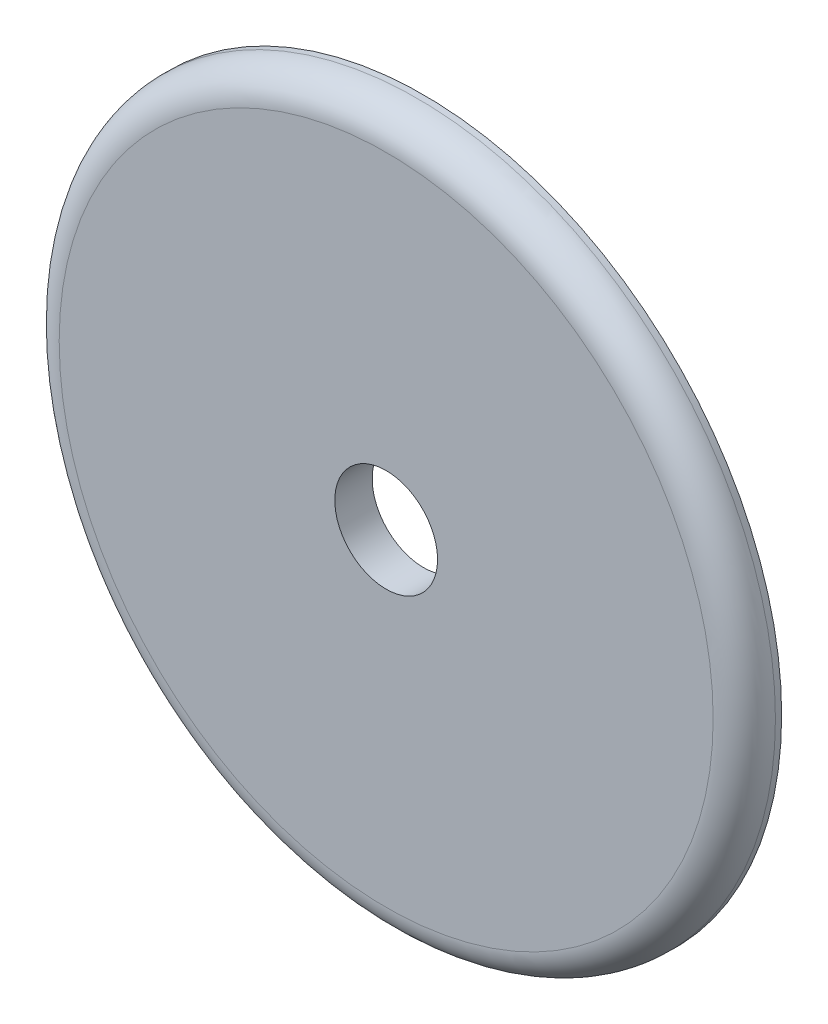
ISO-10303-21;
HEADER;
FILE_DESCRIPTION(('STEP AP214'),'2;1');
FILE_NAME('part.step','',(''),(''),'','','');
FILE_SCHEMA(('AUTOMOTIVE_DESIGN { 1 0 10303 214 1 1 1 1 }'));
ENDSEC;
DATA;
#1=APPLICATION_CONTEXT('core data for automotive mechanical design processes');
#2=APPLICATION_PROTOCOL_DEFINITION('international standard','automotive_design',2000,#1);
#3=PRODUCT_CONTEXT('',#1,'mechanical');
#4=PRODUCT('Part','Part','',(#3));
#5=PRODUCT_RELATED_PRODUCT_CATEGORY('part','',(#4));
#6=PRODUCT_DEFINITION_FORMATION('','',#4);
#7=PRODUCT_DEFINITION_CONTEXT('part definition',#1,'design');
#8=PRODUCT_DEFINITION('design','',#6,#7);
#9=PRODUCT_DEFINITION_SHAPE('','',#8);
#10=(LENGTH_UNIT() NAMED_UNIT(*) SI_UNIT(.MILLI.,.METRE.));
#11=(NAMED_UNIT(*) PLANE_ANGLE_UNIT() SI_UNIT($,.RADIAN.));
#12=(NAMED_UNIT(*) SI_UNIT($,.STERADIAN.) SOLID_ANGLE_UNIT());
#13=UNCERTAINTY_MEASURE_WITH_UNIT(LENGTH_MEASURE(1.E-05),#10,'distance_accuracy_value','');
#14=(GEOMETRIC_REPRESENTATION_CONTEXT(3) GLOBAL_UNCERTAINTY_ASSIGNED_CONTEXT((#13)) GLOBAL_UNIT_ASSIGNED_CONTEXT((#10,
#11,#12)) REPRESENTATION_CONTEXT('',''));
#15=CARTESIAN_POINT('',(0.,0.,0.));
#16=DIRECTION('',(0.,0.,1.));
#17=DIRECTION('',(1.,0.,0.));
#18=AXIS2_PLACEMENT_3D('',#15,#16,#17);
#19=CARTESIAN_POINT('',(0.,0.,1.2));
#20=DIRECTION('',(0.,0.,1.));
#21=DIRECTION('',(1.,0.,0.));
#22=AXIS2_PLACEMENT_3D('',#19,#20,#21);
#23=PLANE('',#22);
#24=CARTESIAN_POINT('',(0.,0.,1.2));
#25=DIRECTION('',(0.,0.,1.));
#26=DIRECTION('',(1.,0.,0.));
#27=AXIS2_PLACEMENT_3D('',#24,#25,#26);
#28=CIRCLE('',#27,10.5);
#29=CARTESIAN_POINT('',(10.5,0.,1.2));
#30=VERTEX_POINT('',#29);
#31=EDGE_CURVE('E45',#30,#30,#28,.T.);
#32=ORIENTED_EDGE('',*,*,#31,.T.);
#33=EDGE_LOOP('',(#32));
#34=FACE_BOUND('',#33,.T.);
#35=CARTESIAN_POINT('',(0.,0.,1.2));
#36=DIRECTION('',(0.,0.,1.));
#37=DIRECTION('',(1.,0.,0.));
#38=AXIS2_PLACEMENT_3D('',#35,#36,#37);
#39=CIRCLE('',#38,1.65);
#40=CARTESIAN_POINT('',(1.65,0.,1.2));
#41=VERTEX_POINT('',#40);
#42=EDGE_CURVE('E55',#41,#41,#39,.T.);
#43=ORIENTED_EDGE('',*,*,#42,.F.);
#44=EDGE_LOOP('',(#43));
#45=FACE_BOUND('',#44,.T.);
#46=ADVANCED_FACE('F37',(#34,#45),#23,.T.);
#47=CARTESIAN_POINT('',(0.,0.,0.));
#48=DIRECTION('',(0.,0.,1.));
#49=DIRECTION('',(1.,0.,0.));
#50=AXIS2_PLACEMENT_3D('',#47,#48,#49);
#51=PLANE('',#50);
#52=CARTESIAN_POINT('',(0.,0.,0.));
#53=DIRECTION('',(0.,0.,1.));
#54=DIRECTION('',(1.,0.,0.));
#55=AXIS2_PLACEMENT_3D('',#52,#53,#54);
#56=CIRCLE('',#55,11.5);
#57=CARTESIAN_POINT('',(11.5,0.,0.));
#58=VERTEX_POINT('',#57);
#59=EDGE_CURVE('E50',#58,#58,#56,.T.);
#60=ORIENTED_EDGE('',*,*,#59,.F.);
#61=EDGE_LOOP('',(#60));
#62=FACE_BOUND('',#61,.T.);
#63=CARTESIAN_POINT('',(0.,0.,0.));
#64=DIRECTION('',(0.,0.,1.));
#65=DIRECTION('',(1.,0.,0.));
#66=AXIS2_PLACEMENT_3D('',#63,#64,#65);
#67=CIRCLE('',#66,1.65);
#68=CARTESIAN_POINT('',(1.65,0.,0.));
#69=VERTEX_POINT('',#68);
#70=EDGE_CURVE('E58',#69,#69,#67,.T.);
#71=ORIENTED_EDGE('',*,*,#70,.T.);
#72=EDGE_LOOP('',(#71));
#73=FACE_BOUND('',#72,.T.);
#74=ADVANCED_FACE('F70',(#62,#73),#51,.F.);
#75=CARTESIAN_POINT('',(0.,0.,1.2));
#76=DIRECTION('',(0.,0.,-1.));
#77=DIRECTION('',(-1.,0.,0.));
#78=AXIS2_PLACEMENT_3D('',#75,#76,#77);
#79=CYLINDRICAL_SURFACE('',#78,11.5);
#80=CARTESIAN_POINT('',(0.,0.,0.2));
#81=DIRECTION('',(0.,0.,1.));
#82=DIRECTION('',(1.,0.,0.));
#83=AXIS2_PLACEMENT_3D('',#80,#81,#82);
#84=CIRCLE('',#83,11.5);
#85=CARTESIAN_POINT('',(11.5,0.,0.2));
#86=VERTEX_POINT('',#85);
#87=EDGE_CURVE('E10',#86,#86,#84,.F.);
#88=ORIENTED_EDGE('',*,*,#87,.T.);
#89=EDGE_LOOP('',(#88));
#90=FACE_BOUND('',#89,.T.);
#91=ORIENTED_EDGE('',*,*,#59,.T.);
#92=EDGE_LOOP('',(#91));
#93=FACE_BOUND('',#92,.T.);
#94=ADVANCED_FACE('F75',(#90,#93),#79,.T.);
#95=CARTESIAN_POINT('',(0.,0.,1.2));
#96=DIRECTION('',(0.,0.,-1.));
#97=DIRECTION('',(-1.,0.,0.));
#98=AXIS2_PLACEMENT_3D('',#95,#96,#97);
#99=CYLINDRICAL_SURFACE('',#98,1.65);
#100=ORIENTED_EDGE('',*,*,#42,.T.);
#101=EDGE_LOOP('',(#100));
#102=FACE_BOUND('',#101,.T.);
#103=ORIENTED_EDGE('',*,*,#70,.F.);
#104=EDGE_LOOP('',(#103));
#105=FACE_BOUND('',#104,.T.);
#106=ADVANCED_FACE('F66',(#102,#105),#99,.F.);
#107=CARTESIAN_POINT('',(0.,0.,0.2));
#108=DIRECTION('',(0.,0.,1.));
#109=DIRECTION('',(1.,0.,0.));
#110=AXIS2_PLACEMENT_3D('',#107,#108,#109);
#111=TOROIDAL_SURFACE('',#110,10.5,1.);
#112=ORIENTED_EDGE('',*,*,#87,.F.);
#113=EDGE_LOOP('',(#112));
#114=FACE_BOUND('',#113,.T.);
#115=ORIENTED_EDGE('',*,*,#31,.F.);
#116=EDGE_LOOP('',(#115));
#117=FACE_BOUND('',#116,.T.);
#118=ADVANCED_FACE('F39',(#114,#117),#111,.T.);
#119=CLOSED_SHELL('',(#46,#74,#94,#106,#118));
#120=MANIFOLD_SOLID_BREP('B2',#119);
#121=ADVANCED_BREP_SHAPE_REPRESENTATION('',(#18,#120),#14);
#122=SHAPE_DEFINITION_REPRESENTATION(#9,#121);
ENDSEC;
END-ISO-10303-21;
